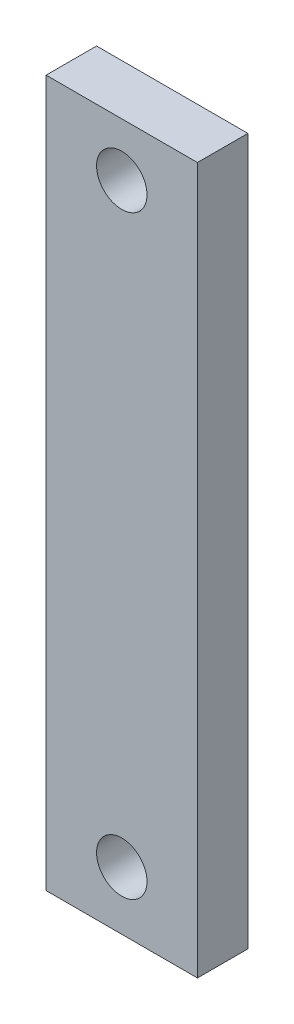
ISO-10303-21;
HEADER;
FILE_DESCRIPTION(('STEP AP214'),'2;1');
FILE_NAME('part.step','',(''),(''),'','','');
FILE_SCHEMA(('AUTOMOTIVE_DESIGN { 1 0 10303 214 1 1 1 1 }'));
ENDSEC;
DATA;
#1=APPLICATION_CONTEXT('core data for automotive mechanical design processes');
#2=APPLICATION_PROTOCOL_DEFINITION('international standard','automotive_design',2000,#1);
#3=PRODUCT_CONTEXT('',#1,'mechanical');
#4=PRODUCT('Part','Part','',(#3));
#5=PRODUCT_RELATED_PRODUCT_CATEGORY('part','',(#4));
#6=PRODUCT_DEFINITION_FORMATION('','',#4);
#7=PRODUCT_DEFINITION_CONTEXT('part definition',#1,'design');
#8=PRODUCT_DEFINITION('design','',#6,#7);
#9=PRODUCT_DEFINITION_SHAPE('','',#8);
#10=(LENGTH_UNIT() NAMED_UNIT(*) SI_UNIT(.MILLI.,.METRE.));
#11=(NAMED_UNIT(*) PLANE_ANGLE_UNIT() SI_UNIT($,.RADIAN.));
#12=(NAMED_UNIT(*) SI_UNIT($,.STERADIAN.) SOLID_ANGLE_UNIT());
#13=UNCERTAINTY_MEASURE_WITH_UNIT(LENGTH_MEASURE(1.E-05),#10,'distance_accuracy_value','');
#14=(GEOMETRIC_REPRESENTATION_CONTEXT(3) GLOBAL_UNCERTAINTY_ASSIGNED_CONTEXT((#13)) GLOBAL_UNIT_ASSIGNED_CONTEXT((#10,
#11,#12)) REPRESENTATION_CONTEXT('',''));
#15=CARTESIAN_POINT('',(0.,0.,0.));
#16=DIRECTION('',(0.,0.,1.));
#17=DIRECTION('',(1.,0.,0.));
#18=AXIS2_PLACEMENT_3D('',#15,#16,#17);
#19=CARTESIAN_POINT('',(0.,0.,12.7));
#20=DIRECTION('',(-1.,0.,0.));
#21=DIRECTION('',(0.,-1.,0.));
#22=AXIS2_PLACEMENT_3D('',#19,#20,#21);
#23=PLANE('',#22);
#24=DIRECTION('',(0.,1.,0.));
#25=VECTOR('',#24,1.);
#26=CARTESIAN_POINT('',(0.,0.,0.));
#27=LINE('',#26,#25);
#28=CARTESIAN_POINT('',(0.,0.,0.));
#29=VERTEX_POINT('',#28);
#30=CARTESIAN_POINT('',(0.,177.8,0.));
#31=VERTEX_POINT('',#30);
#32=EDGE_CURVE('E105',#29,#31,#27,.T.);
#33=ORIENTED_EDGE('',*,*,#32,.T.);
#34=DIRECTION('',(0.,0.,-1.));
#35=VECTOR('',#34,1.);
#36=CARTESIAN_POINT('',(0.,177.8,12.7));
#37=LINE('',#36,#35);
#38=CARTESIAN_POINT('',(0.,177.8,12.7));
#39=VERTEX_POINT('',#38);
#40=EDGE_CURVE('E11',#39,#31,#37,.T.);
#41=ORIENTED_EDGE('',*,*,#40,.F.);
#42=DIRECTION('',(0.,1.,0.));
#43=VECTOR('',#42,1.);
#44=CARTESIAN_POINT('',(0.,0.,12.7));
#45=LINE('',#44,#43);
#46=CARTESIAN_POINT('',(0.,0.,12.7));
#47=VERTEX_POINT('',#46);
#48=EDGE_CURVE('E93',#47,#39,#45,.T.);
#49=ORIENTED_EDGE('',*,*,#48,.F.);
#50=DIRECTION('',(0.,0.,-1.));
#51=VECTOR('',#50,1.);
#52=CARTESIAN_POINT('',(0.,0.,12.7));
#53=LINE('',#52,#51);
#54=EDGE_CURVE('E101',#47,#29,#53,.T.);
#55=ORIENTED_EDGE('',*,*,#54,.T.);
#56=EDGE_LOOP('',(#33,#41,#49,#55));
#57=FACE_BOUND('',#56,.T.);
#58=ADVANCED_FACE('F42',(#57),#23,.F.);
#59=CARTESIAN_POINT('',(0.,177.8,12.7));
#60=DIRECTION('',(0.,-1.,0.));
#61=DIRECTION('',(0.,0.,-1.));
#62=AXIS2_PLACEMENT_3D('',#59,#60,#61);
#63=PLANE('',#62);
#64=DIRECTION('',(-1.,0.,0.));
#65=VECTOR('',#64,1.);
#66=CARTESIAN_POINT('',(0.,177.8,0.));
#67=LINE('',#66,#65);
#68=CARTESIAN_POINT('',(-38.1,177.8,0.));
#69=VERTEX_POINT('',#68);
#70=EDGE_CURVE('E97',#31,#69,#67,.T.);
#71=ORIENTED_EDGE('',*,*,#70,.T.);
#72=DIRECTION('',(0.,0.,-1.));
#73=VECTOR('',#72,1.);
#74=CARTESIAN_POINT('',(-38.1,177.8,12.7));
#75=LINE('',#74,#73);
#76=CARTESIAN_POINT('',(-38.1,177.8,12.7));
#77=VERTEX_POINT('',#76);
#78=EDGE_CURVE('E50',#77,#69,#75,.T.);
#79=ORIENTED_EDGE('',*,*,#78,.F.);
#80=DIRECTION('',(-1.,0.,0.));
#81=VECTOR('',#80,1.);
#82=CARTESIAN_POINT('',(0.,177.8,12.7));
#83=LINE('',#82,#81);
#84=EDGE_CURVE('E88',#39,#77,#83,.T.);
#85=ORIENTED_EDGE('',*,*,#84,.F.);
#86=ORIENTED_EDGE('',*,*,#40,.T.);
#87=EDGE_LOOP('',(#71,#79,#85,#86));
#88=FACE_BOUND('',#87,.T.);
#89=ADVANCED_FACE('F96',(#88),#63,.F.);
#90=CARTESIAN_POINT('',(-38.1,0.,12.7));
#91=DIRECTION('',(1.,0.,0.));
#92=DIRECTION('',(0.,0.,-1.));
#93=AXIS2_PLACEMENT_3D('',#90,#91,#92);
#94=PLANE('',#93);
#95=DIRECTION('',(0.,-1.,0.));
#96=VECTOR('',#95,1.);
#97=CARTESIAN_POINT('',(-38.1,0.,0.));
#98=LINE('',#97,#96);
#99=CARTESIAN_POINT('',(-38.1,0.,0.));
#100=VERTEX_POINT('',#99);
#101=EDGE_CURVE('E75',#69,#100,#98,.T.);
#102=ORIENTED_EDGE('',*,*,#101,.T.);
#103=DIRECTION('',(0.,0.,-1.));
#104=VECTOR('',#103,1.);
#105=CARTESIAN_POINT('',(-38.1,0.,12.7));
#106=LINE('',#105,#104);
#107=CARTESIAN_POINT('',(-38.1,0.,12.7));
#108=VERTEX_POINT('',#107);
#109=EDGE_CURVE('E98',#108,#100,#106,.T.);
#110=ORIENTED_EDGE('',*,*,#109,.F.);
#111=DIRECTION('',(0.,-1.,0.));
#112=VECTOR('',#111,1.);
#113=CARTESIAN_POINT('',(-38.1,0.,12.7));
#114=LINE('',#113,#112);
#115=EDGE_CURVE('E91',#77,#108,#114,.T.);
#116=ORIENTED_EDGE('',*,*,#115,.F.);
#117=ORIENTED_EDGE('',*,*,#78,.T.);
#118=EDGE_LOOP('',(#102,#110,#116,#117));
#119=FACE_BOUND('',#118,.T.);
#120=ADVANCED_FACE('F99',(#119),#94,.F.);
#121=CARTESIAN_POINT('',(0.,0.,12.7));
#122=DIRECTION('',(0.,1.,0.));
#123=DIRECTION('',(-1.,0.,0.));
#124=AXIS2_PLACEMENT_3D('',#121,#122,#123);
#125=PLANE('',#124);
#126=DIRECTION('',(1.,0.,0.));
#127=VECTOR('',#126,1.);
#128=CARTESIAN_POINT('',(0.,0.,0.));
#129=LINE('',#128,#127);
#130=EDGE_CURVE('E81',#100,#29,#129,.T.);
#131=ORIENTED_EDGE('',*,*,#130,.T.);
#132=ORIENTED_EDGE('',*,*,#54,.F.);
#133=DIRECTION('',(1.,0.,0.));
#134=VECTOR('',#133,1.);
#135=CARTESIAN_POINT('',(0.,0.,12.7));
#136=LINE('',#135,#134);
#137=EDGE_CURVE('E58',#108,#47,#136,.T.);
#138=ORIENTED_EDGE('',*,*,#137,.F.);
#139=ORIENTED_EDGE('',*,*,#109,.T.);
#140=EDGE_LOOP('',(#131,#132,#138,#139));
#141=FACE_BOUND('',#140,.T.);
#142=ADVANCED_FACE('F113',(#141),#125,.F.);
#143=CARTESIAN_POINT('',(0.,0.,12.7));
#144=DIRECTION('',(0.,0.,1.));
#145=DIRECTION('',(1.,0.,0.));
#146=AXIS2_PLACEMENT_3D('',#143,#144,#145);
#147=PLANE('',#146);
#148=CARTESIAN_POINT('',(-19.05,14.6574539678747,12.7));
#149=DIRECTION('',(0.,0.,1.));
#150=DIRECTION('',(1.,0.,0.));
#151=AXIS2_PLACEMENT_3D('',#148,#149,#150);
#152=CIRCLE('',#151,6.35);
#153=CARTESIAN_POINT('',(-12.7,14.6574539678747,12.7));
#154=VERTEX_POINT('',#153);
#155=EDGE_CURVE('E125',#154,#154,#152,.T.);
#156=ORIENTED_EDGE('',*,*,#155,.F.);
#157=EDGE_LOOP('',(#156));
#158=FACE_BOUND('',#157,.T.);
#159=CARTESIAN_POINT('',(-19.05,164.387233426786,12.7));
#160=DIRECTION('',(0.,0.,1.));
#161=DIRECTION('',(1.,0.,0.));
#162=AXIS2_PLACEMENT_3D('',#159,#160,#161);
#163=CIRCLE('',#162,6.35);
#164=CARTESIAN_POINT('',(-12.7,164.387233426786,12.7));
#165=VERTEX_POINT('',#164);
#166=EDGE_CURVE('E119',#165,#165,#163,.T.);
#167=ORIENTED_EDGE('',*,*,#166,.F.);
#168=EDGE_LOOP('',(#167));
#169=FACE_BOUND('',#168,.T.);
#170=ORIENTED_EDGE('',*,*,#48,.T.);
#171=ORIENTED_EDGE('',*,*,#84,.T.);
#172=ORIENTED_EDGE('',*,*,#115,.T.);
#173=ORIENTED_EDGE('',*,*,#137,.T.);
#174=EDGE_LOOP('',(#170,#171,#172,#173));
#175=FACE_BOUND('',#174,.T.);
#176=ADVANCED_FACE('F89',(#158,#169,#175),#147,.T.);
#177=CARTESIAN_POINT('',(0.,0.,0.));
#178=DIRECTION('',(0.,0.,1.));
#179=DIRECTION('',(1.,0.,0.));
#180=AXIS2_PLACEMENT_3D('',#177,#178,#179);
#181=PLANE('',#180);
#182=CARTESIAN_POINT('',(-19.05,14.6574539678747,0.));
#183=DIRECTION('',(0.,0.,1.));
#184=DIRECTION('',(1.,0.,0.));
#185=AXIS2_PLACEMENT_3D('',#182,#183,#184);
#186=CIRCLE('',#185,6.35);
#187=CARTESIAN_POINT('',(-12.7,14.6574539678747,0.));
#188=VERTEX_POINT('',#187);
#189=EDGE_CURVE('E122',#188,#188,#186,.T.);
#190=ORIENTED_EDGE('',*,*,#189,.T.);
#191=EDGE_LOOP('',(#190));
#192=FACE_BOUND('',#191,.T.);
#193=CARTESIAN_POINT('',(-19.05,164.387233426786,0.));
#194=DIRECTION('',(0.,0.,1.));
#195=DIRECTION('',(1.,0.,0.));
#196=AXIS2_PLACEMENT_3D('',#193,#194,#195);
#197=CIRCLE('',#196,6.35);
#198=CARTESIAN_POINT('',(-12.7,164.387233426786,0.));
#199=VERTEX_POINT('',#198);
#200=EDGE_CURVE('E108',#199,#199,#197,.T.);
#201=ORIENTED_EDGE('',*,*,#200,.T.);
#202=EDGE_LOOP('',(#201));
#203=FACE_BOUND('',#202,.T.);
#204=ORIENTED_EDGE('',*,*,#32,.F.);
#205=ORIENTED_EDGE('',*,*,#130,.F.);
#206=ORIENTED_EDGE('',*,*,#101,.F.);
#207=ORIENTED_EDGE('',*,*,#70,.F.);
#208=EDGE_LOOP('',(#204,#205,#206,#207));
#209=FACE_BOUND('',#208,.T.);
#210=ADVANCED_FACE('F116',(#192,#203,#209),#181,.F.);
#211=CARTESIAN_POINT('',(-19.05,164.387233426786,0.));
#212=DIRECTION('',(0.,0.,1.));
#213=DIRECTION('',(1.,0.,0.));
#214=AXIS2_PLACEMENT_3D('',#211,#212,#213);
#215=CYLINDRICAL_SURFACE('',#214,6.35);
#216=ORIENTED_EDGE('',*,*,#200,.F.);
#217=EDGE_LOOP('',(#216));
#218=FACE_BOUND('',#217,.T.);
#219=ORIENTED_EDGE('',*,*,#166,.T.);
#220=EDGE_LOOP('',(#219));
#221=FACE_BOUND('',#220,.T.);
#222=ADVANCED_FACE('F136',(#218,#221),#215,.F.);
#223=CARTESIAN_POINT('',(-19.05,14.6574539678747,0.));
#224=DIRECTION('',(0.,0.,1.));
#225=DIRECTION('',(1.,0.,0.));
#226=AXIS2_PLACEMENT_3D('',#223,#224,#225);
#227=CYLINDRICAL_SURFACE('',#226,6.35);
#228=ORIENTED_EDGE('',*,*,#189,.F.);
#229=EDGE_LOOP('',(#228));
#230=FACE_BOUND('',#229,.T.);
#231=ORIENTED_EDGE('',*,*,#155,.T.);
#232=EDGE_LOOP('',(#231));
#233=FACE_BOUND('',#232,.T.);
#234=ADVANCED_FACE('F133',(#230,#233),#227,.F.);
#235=CLOSED_SHELL('',(#58,#89,#120,#142,#176,#210,#222,#234));
#236=MANIFOLD_SOLID_BREP('B2',#235);
#237=ADVANCED_BREP_SHAPE_REPRESENTATION('',(#18,#236),#14);
#238=SHAPE_DEFINITION_REPRESENTATION(#9,#237);
ENDSEC;
END-ISO-10303-21;
